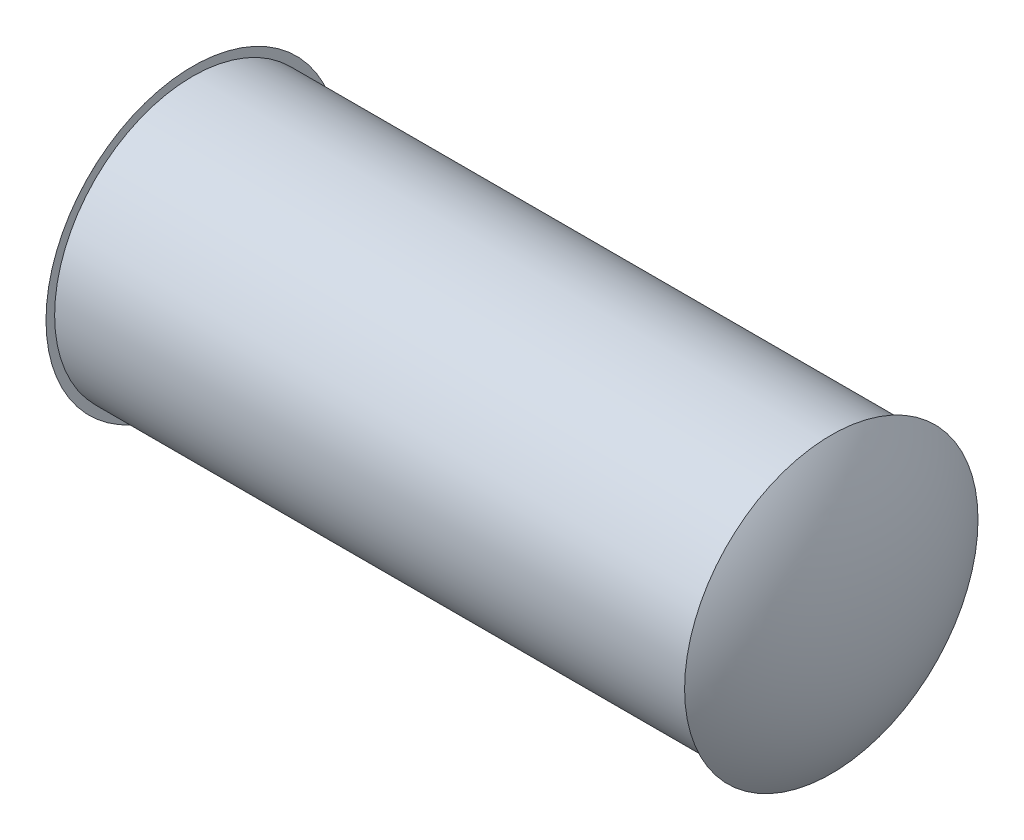
ISO-10303-21;
HEADER;
FILE_DESCRIPTION(('STEP AP214'),'2;1');
FILE_NAME('part.step','',(''),(''),'','','');
FILE_SCHEMA(('AUTOMOTIVE_DESIGN { 1 0 10303 214 1 1 1 1 }'));
ENDSEC;
DATA;
#1=APPLICATION_CONTEXT('core data for automotive mechanical design processes');
#2=APPLICATION_PROTOCOL_DEFINITION('international standard','automotive_design',2000,#1);
#3=PRODUCT_CONTEXT('',#1,'mechanical');
#4=PRODUCT('Part','Part','',(#3));
#5=PRODUCT_RELATED_PRODUCT_CATEGORY('part','',(#4));
#6=PRODUCT_DEFINITION_FORMATION('','',#4);
#7=PRODUCT_DEFINITION_CONTEXT('part definition',#1,'design');
#8=PRODUCT_DEFINITION('design','',#6,#7);
#9=PRODUCT_DEFINITION_SHAPE('','',#8);
#10=(LENGTH_UNIT() NAMED_UNIT(*) SI_UNIT(.MILLI.,.METRE.));
#11=(NAMED_UNIT(*) PLANE_ANGLE_UNIT() SI_UNIT($,.RADIAN.));
#12=(NAMED_UNIT(*) SI_UNIT($,.STERADIAN.) SOLID_ANGLE_UNIT());
#13=UNCERTAINTY_MEASURE_WITH_UNIT(LENGTH_MEASURE(1.E-05),#10,'distance_accuracy_value','');
#14=(GEOMETRIC_REPRESENTATION_CONTEXT(3) GLOBAL_UNCERTAINTY_ASSIGNED_CONTEXT((#13)) GLOBAL_UNIT_ASSIGNED_CONTEXT((#10,
#11,#12)) REPRESENTATION_CONTEXT('',''));
#15=CARTESIAN_POINT('',(0.,0.,0.));
#16=DIRECTION('',(0.,0.,1.));
#17=DIRECTION('',(1.,0.,0.));
#18=AXIS2_PLACEMENT_3D('',#15,#16,#17);
#19=CARTESIAN_POINT('',(-9.398,0.,0.));
#20=DIRECTION('',(1.,0.,0.));
#21=DIRECTION('',(0.,0.,-1.));
#22=AXIS2_PLACEMENT_3D('',#19,#20,#21);
#23=CYLINDRICAL_SURFACE('',#22,4.064);
#24=CARTESIAN_POINT('',(-9.398,0.,0.));
#25=DIRECTION('',(-1.,0.,0.));
#26=DIRECTION('',(0.,0.,1.));
#27=AXIS2_PLACEMENT_3D('',#24,#25,#26);
#28=CIRCLE('',#27,4.064);
#29=CARTESIAN_POINT('',(-9.398,0.,4.064));
#30=VERTEX_POINT('',#29);
#31=EDGE_CURVE('E71',#30,#30,#28,.F.);
#32=ORIENTED_EDGE('',*,*,#31,.T.);
#33=EDGE_LOOP('',(#32));
#34=FACE_BOUND('',#33,.T.);
#35=CARTESIAN_POINT('',(9.398,0.,0.));
#36=DIRECTION('',(1.,0.,0.));
#37=DIRECTION('',(0.,0.,-1.));
#38=AXIS2_PLACEMENT_3D('',#35,#36,#37);
#39=CIRCLE('',#38,4.064);
#40=CARTESIAN_POINT('',(9.398,0.,-4.064));
#41=VERTEX_POINT('',#40);
#42=EDGE_CURVE('E11',#41,#41,#39,.T.);
#43=ORIENTED_EDGE('',*,*,#42,.F.);
#44=EDGE_LOOP('',(#43));
#45=FACE_BOUND('',#44,.T.);
#46=ADVANCED_FACE('F32',(#34,#45),#23,.T.);
#47=CARTESIAN_POINT('',(10.668,0.,0.));
#48=CARTESIAN_POINT('',(10.668,0.,-2.5954395745392));
#49=CARTESIAN_POINT('',(9.398,0.,-4.318));
#50=B_SPLINE_CURVE_WITH_KNOTS('',2,(#47,#48,#49),.UNSPECIFIED.,.F.,.F.,(3,3),(0.,1.),.UNSPECIFIED.);
#51=CARTESIAN_POINT('',(9.398,0.,0.));
#52=DIRECTION('',(-1.,0.,0.));
#53=AXIS1_PLACEMENT('',#51,#52);
#54=SURFACE_OF_REVOLUTION('',#50,#53);
#55=CARTESIAN_POINT('',(9.398,0.,0.));
#56=DIRECTION('',(-1.,0.,0.));
#57=DIRECTION('',(0.,0.,1.));
#58=AXIS2_PLACEMENT_3D('',#55,#56,#57);
#59=CIRCLE('',#58,4.318);
#60=CARTESIAN_POINT('',(9.398,0.,4.318));
#61=VERTEX_POINT('',#60);
#62=EDGE_CURVE('E39',#61,#61,#59,.T.);
#63=ORIENTED_EDGE('',*,*,#62,.F.);
#64=EDGE_LOOP('',(#63));
#65=FACE_BOUND('',#64,.T.);
#66=CARTESIAN_POINT('',(10.668,0.,0.));
#67=VERTEX_POINT('',#66);
#68=VERTEX_LOOP('',#67);
#69=FACE_BOUND('',#68,.T.);
#70=ADVANCED_FACE('F57',(#65,#69),#54,.T.);
#71=CARTESIAN_POINT('',(9.398,0.,0.));
#72=DIRECTION('',(1.,0.,0.));
#73=DIRECTION('',(0.,0.,-1.));
#74=AXIS2_PLACEMENT_3D('',#71,#72,#73);
#75=PLANE('',#74);
#76=ORIENTED_EDGE('',*,*,#42,.T.);
#77=EDGE_LOOP('',(#76));
#78=FACE_BOUND('',#77,.T.);
#79=ORIENTED_EDGE('',*,*,#62,.T.);
#80=EDGE_LOOP('',(#79));
#81=FACE_BOUND('',#80,.T.);
#82=ADVANCED_FACE('F48',(#78,#81),#75,.F.);
#83=CARTESIAN_POINT('',(-10.668,0.,0.));
#84=CARTESIAN_POINT('',(-10.668,0.,-2.5954395745392));
#85=CARTESIAN_POINT('',(-9.398,0.,-4.318));
#86=B_SPLINE_CURVE_WITH_KNOTS('',2,(#83,#84,#85),.UNSPECIFIED.,.F.,.F.,(3,3),(0.,1.),.UNSPECIFIED.);
#87=CARTESIAN_POINT('',(-9.398,0.,0.));
#88=DIRECTION('',(1.,0.,0.));
#89=AXIS1_PLACEMENT('',#87,#88);
#90=SURFACE_OF_REVOLUTION('',#86,#89);
#91=CARTESIAN_POINT('',(-9.398,0.,0.));
#92=DIRECTION('',(-1.,0.,0.));
#93=DIRECTION('',(0.,0.,1.));
#94=AXIS2_PLACEMENT_3D('',#91,#92,#93);
#95=CIRCLE('',#94,4.318);
#96=CARTESIAN_POINT('',(-9.398,0.,4.318));
#97=VERTEX_POINT('',#96);
#98=EDGE_CURVE('E76',#97,#97,#95,.T.);
#99=ORIENTED_EDGE('',*,*,#98,.T.);
#100=EDGE_LOOP('',(#99));
#101=FACE_BOUND('',#100,.T.);
#102=CARTESIAN_POINT('',(-10.668,0.,0.));
#103=VERTEX_POINT('',#102);
#104=VERTEX_LOOP('',#103);
#105=FACE_BOUND('',#104,.T.);
#106=ADVANCED_FACE('F45',(#101,#105),#90,.T.);
#107=CARTESIAN_POINT('',(-9.398,0.,0.));
#108=DIRECTION('',(-1.,0.,0.));
#109=DIRECTION('',(0.,0.,-1.));
#110=AXIS2_PLACEMENT_3D('',#107,#108,#109);
#111=PLANE('',#110);
#112=ORIENTED_EDGE('',*,*,#31,.F.);
#113=EDGE_LOOP('',(#112));
#114=FACE_BOUND('',#113,.T.);
#115=ORIENTED_EDGE('',*,*,#98,.F.);
#116=EDGE_LOOP('',(#115));
#117=FACE_BOUND('',#116,.T.);
#118=ADVANCED_FACE('F47',(#114,#117),#111,.F.);
#119=CLOSED_SHELL('',(#46,#70,#82,#106,#118));
#120=MANIFOLD_SOLID_BREP('B2',#119);
#121=ADVANCED_BREP_SHAPE_REPRESENTATION('',(#18,#120),#14);
#122=SHAPE_DEFINITION_REPRESENTATION(#9,#121);
ENDSEC;
END-ISO-10303-21;
